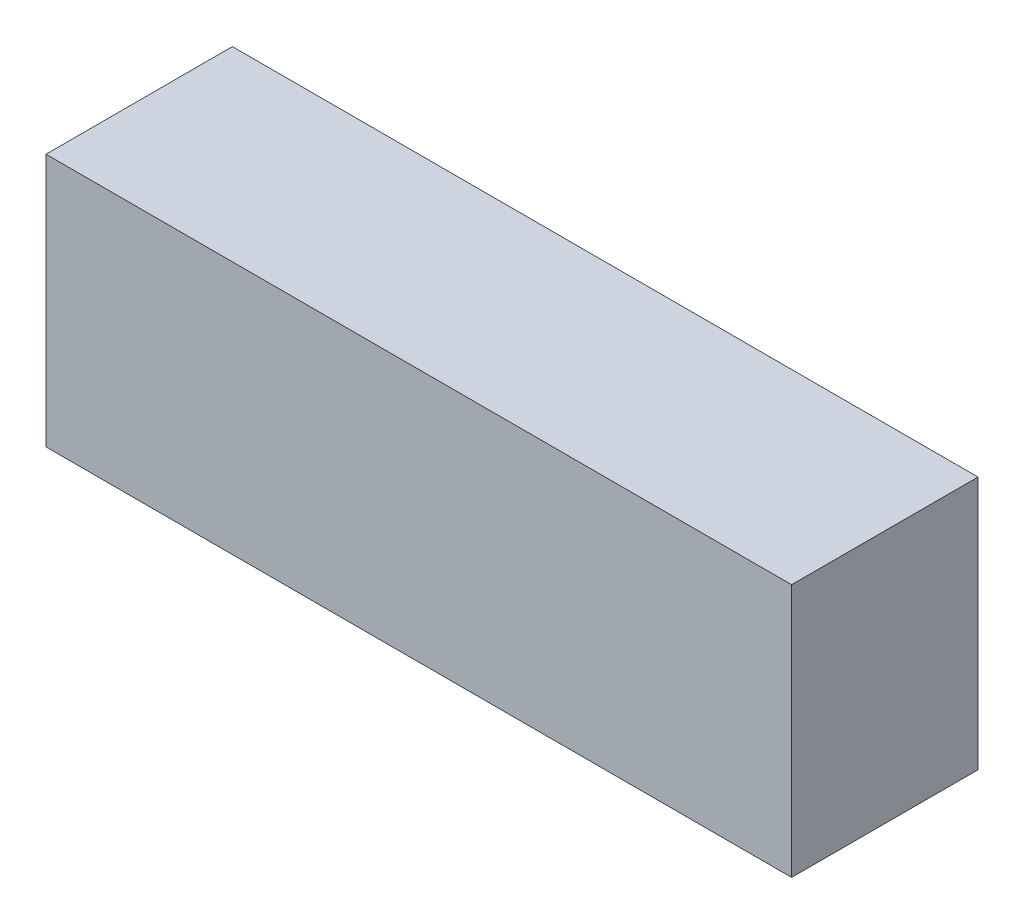
ISO-10303-21;
HEADER;
FILE_DESCRIPTION(('STEP AP214'),'2;1');
FILE_NAME('part.step','',(''),(''),'','','');
FILE_SCHEMA(('AUTOMOTIVE_DESIGN { 1 0 10303 214 1 1 1 1 }'));
ENDSEC;
DATA;
#1=APPLICATION_CONTEXT('core data for automotive mechanical design processes');
#2=APPLICATION_PROTOCOL_DEFINITION('international standard','automotive_design',2000,#1);
#3=PRODUCT_CONTEXT('',#1,'mechanical');
#4=PRODUCT('Part','Part','',(#3));
#5=PRODUCT_RELATED_PRODUCT_CATEGORY('part','',(#4));
#6=PRODUCT_DEFINITION_FORMATION('','',#4);
#7=PRODUCT_DEFINITION_CONTEXT('part definition',#1,'design');
#8=PRODUCT_DEFINITION('design','',#6,#7);
#9=PRODUCT_DEFINITION_SHAPE('','',#8);
#10=(LENGTH_UNIT() NAMED_UNIT(*) SI_UNIT(.MILLI.,.METRE.));
#11=(NAMED_UNIT(*) PLANE_ANGLE_UNIT() SI_UNIT($,.RADIAN.));
#12=(NAMED_UNIT(*) SI_UNIT($,.STERADIAN.) SOLID_ANGLE_UNIT());
#13=UNCERTAINTY_MEASURE_WITH_UNIT(LENGTH_MEASURE(1.E-05),#10,'distance_accuracy_value','');
#14=(GEOMETRIC_REPRESENTATION_CONTEXT(3) GLOBAL_UNCERTAINTY_ASSIGNED_CONTEXT((#13)) GLOBAL_UNIT_ASSIGNED_CONTEXT((#10,
#11,#12)) REPRESENTATION_CONTEXT('',''));
#15=CARTESIAN_POINT('',(0.,0.,0.));
#16=DIRECTION('',(0.,0.,1.));
#17=DIRECTION('',(1.,0.,0.));
#18=AXIS2_PLACEMENT_3D('',#15,#16,#17);
#19=CARTESIAN_POINT('',(0.,0.,25.));
#20=DIRECTION('',(1.,0.,0.));
#21=DIRECTION('',(0.,1.,0.));
#22=AXIS2_PLACEMENT_3D('',#19,#20,#21);
#23=PLANE('',#22);
#24=DIRECTION('',(0.,-1.,0.));
#25=VECTOR('',#24,1.);
#26=CARTESIAN_POINT('',(0.,0.,0.));
#27=LINE('',#26,#25);
#28=CARTESIAN_POINT('',(0.,34.,0.));
#29=VERTEX_POINT('',#28);
#30=CARTESIAN_POINT('',(0.,0.,0.));
#31=VERTEX_POINT('',#30);
#32=EDGE_CURVE('E107',#29,#31,#27,.T.);
#33=ORIENTED_EDGE('',*,*,#32,.T.);
#34=DIRECTION('',(0.,0.,-1.));
#35=VECTOR('',#34,1.);
#36=CARTESIAN_POINT('',(0.,0.,25.));
#37=LINE('',#36,#35);
#38=CARTESIAN_POINT('',(0.,0.,25.));
#39=VERTEX_POINT('',#38);
#40=EDGE_CURVE('E11',#39,#31,#37,.T.);
#41=ORIENTED_EDGE('',*,*,#40,.F.);
#42=DIRECTION('',(0.,-1.,0.));
#43=VECTOR('',#42,1.);
#44=CARTESIAN_POINT('',(0.,0.,25.));
#45=LINE('',#44,#43);
#46=CARTESIAN_POINT('',(0.,34.,25.));
#47=VERTEX_POINT('',#46);
#48=EDGE_CURVE('E91',#47,#39,#45,.T.);
#49=ORIENTED_EDGE('',*,*,#48,.F.);
#50=DIRECTION('',(0.,0.,-1.));
#51=VECTOR('',#50,1.);
#52=CARTESIAN_POINT('',(0.,34.,25.));
#53=LINE('',#52,#51);
#54=EDGE_CURVE('E103',#47,#29,#53,.T.);
#55=ORIENTED_EDGE('',*,*,#54,.T.);
#56=EDGE_LOOP('',(#33,#41,#49,#55));
#57=FACE_BOUND('',#56,.T.);
#58=ADVANCED_FACE('F39',(#57),#23,.F.);
#59=CARTESIAN_POINT('',(0.,0.,25.));
#60=DIRECTION('',(0.,1.,0.));
#61=DIRECTION('',(0.,0.,1.));
#62=AXIS2_PLACEMENT_3D('',#59,#60,#61);
#63=PLANE('',#62);
#64=DIRECTION('',(1.,0.,0.));
#65=VECTOR('',#64,1.);
#66=CARTESIAN_POINT('',(0.,0.,0.));
#67=LINE('',#66,#65);
#68=CARTESIAN_POINT('',(100.,0.,0.));
#69=VERTEX_POINT('',#68);
#70=EDGE_CURVE('E96',#31,#69,#67,.T.);
#71=ORIENTED_EDGE('',*,*,#70,.T.);
#72=DIRECTION('',(0.,0.,-1.));
#73=VECTOR('',#72,1.);
#74=CARTESIAN_POINT('',(100.,0.,25.));
#75=LINE('',#74,#73);
#76=CARTESIAN_POINT('',(100.,0.,25.));
#77=VERTEX_POINT('',#76);
#78=EDGE_CURVE('E48',#77,#69,#75,.T.);
#79=ORIENTED_EDGE('',*,*,#78,.F.);
#80=DIRECTION('',(1.,0.,0.));
#81=VECTOR('',#80,1.);
#82=CARTESIAN_POINT('',(0.,0.,25.));
#83=LINE('',#82,#81);
#84=EDGE_CURVE('E86',#39,#77,#83,.T.);
#85=ORIENTED_EDGE('',*,*,#84,.F.);
#86=ORIENTED_EDGE('',*,*,#40,.T.);
#87=EDGE_LOOP('',(#71,#79,#85,#86));
#88=FACE_BOUND('',#87,.T.);
#89=ADVANCED_FACE('F95',(#88),#63,.F.);
#90=CARTESIAN_POINT('',(100.,0.,25.));
#91=DIRECTION('',(-1.,0.,0.));
#92=DIRECTION('',(0.,0.,1.));
#93=AXIS2_PLACEMENT_3D('',#90,#91,#92);
#94=PLANE('',#93);
#95=DIRECTION('',(0.,1.,0.));
#96=VECTOR('',#95,1.);
#97=CARTESIAN_POINT('',(100.,0.,0.));
#98=LINE('',#97,#96);
#99=CARTESIAN_POINT('',(100.,34.,0.));
#100=VERTEX_POINT('',#99);
#101=EDGE_CURVE('E73',#69,#100,#98,.T.);
#102=ORIENTED_EDGE('',*,*,#101,.T.);
#103=DIRECTION('',(0.,0.,-1.));
#104=VECTOR('',#103,1.);
#105=CARTESIAN_POINT('',(100.,34.,25.));
#106=LINE('',#105,#104);
#107=CARTESIAN_POINT('',(100.,34.,25.));
#108=VERTEX_POINT('',#107);
#109=EDGE_CURVE('E98',#108,#100,#106,.T.);
#110=ORIENTED_EDGE('',*,*,#109,.F.);
#111=DIRECTION('',(0.,1.,0.));
#112=VECTOR('',#111,1.);
#113=CARTESIAN_POINT('',(100.,0.,25.));
#114=LINE('',#113,#112);
#115=EDGE_CURVE('E89',#77,#108,#114,.T.);
#116=ORIENTED_EDGE('',*,*,#115,.F.);
#117=ORIENTED_EDGE('',*,*,#78,.T.);
#118=EDGE_LOOP('',(#102,#110,#116,#117));
#119=FACE_BOUND('',#118,.T.);
#120=ADVANCED_FACE('F99',(#119),#94,.F.);
#121=CARTESIAN_POINT('',(0.,34.,25.));
#122=DIRECTION('',(0.,-1.,0.));
#123=DIRECTION('',(0.,0.,-1.));
#124=AXIS2_PLACEMENT_3D('',#121,#122,#123);
#125=PLANE('',#124);
#126=DIRECTION('',(-1.,0.,0.));
#127=VECTOR('',#126,1.);
#128=CARTESIAN_POINT('',(0.,34.,0.));
#129=LINE('',#128,#127);
#130=EDGE_CURVE('E79',#100,#29,#129,.T.);
#131=ORIENTED_EDGE('',*,*,#130,.T.);
#132=ORIENTED_EDGE('',*,*,#54,.F.);
#133=DIRECTION('',(-1.,0.,0.));
#134=VECTOR('',#133,1.);
#135=CARTESIAN_POINT('',(0.,34.,25.));
#136=LINE('',#135,#134);
#137=EDGE_CURVE('E56',#108,#47,#136,.T.);
#138=ORIENTED_EDGE('',*,*,#137,.F.);
#139=ORIENTED_EDGE('',*,*,#109,.T.);
#140=EDGE_LOOP('',(#131,#132,#138,#139));
#141=FACE_BOUND('',#140,.T.);
#142=ADVANCED_FACE('F120',(#141),#125,.F.);
#143=CARTESIAN_POINT('',(0.,0.,25.));
#144=DIRECTION('',(0.,0.,-1.));
#145=DIRECTION('',(-1.,0.,0.));
#146=AXIS2_PLACEMENT_3D('',#143,#144,#145);
#147=PLANE('',#146);
#148=ORIENTED_EDGE('',*,*,#48,.T.);
#149=ORIENTED_EDGE('',*,*,#84,.T.);
#150=ORIENTED_EDGE('',*,*,#115,.T.);
#151=ORIENTED_EDGE('',*,*,#137,.T.);
#152=EDGE_LOOP('',(#148,#149,#150,#151));
#153=FACE_BOUND('',#152,.T.);
#154=ADVANCED_FACE('F87',(#153),#147,.F.);
#155=CARTESIAN_POINT('',(0.,0.,0.));
#156=DIRECTION('',(0.,0.,-1.));
#157=DIRECTION('',(-1.,0.,0.));
#158=AXIS2_PLACEMENT_3D('',#155,#156,#157);
#159=PLANE('',#158);
#160=ORIENTED_EDGE('',*,*,#32,.F.);
#161=ORIENTED_EDGE('',*,*,#130,.F.);
#162=ORIENTED_EDGE('',*,*,#101,.F.);
#163=ORIENTED_EDGE('',*,*,#70,.F.);
#164=EDGE_LOOP('',(#160,#161,#162,#163));
#165=FACE_BOUND('',#164,.T.);
#166=ADVANCED_FACE('F123',(#165),#159,.T.);
#167=CLOSED_SHELL('',(#58,#89,#120,#142,#154,#166));
#168=MANIFOLD_SOLID_BREP('B2',#167);
#169=ADVANCED_BREP_SHAPE_REPRESENTATION('',(#18,#168),#14);
#170=SHAPE_DEFINITION_REPRESENTATION(#9,#169);
ENDSEC;
END-ISO-10303-21;
